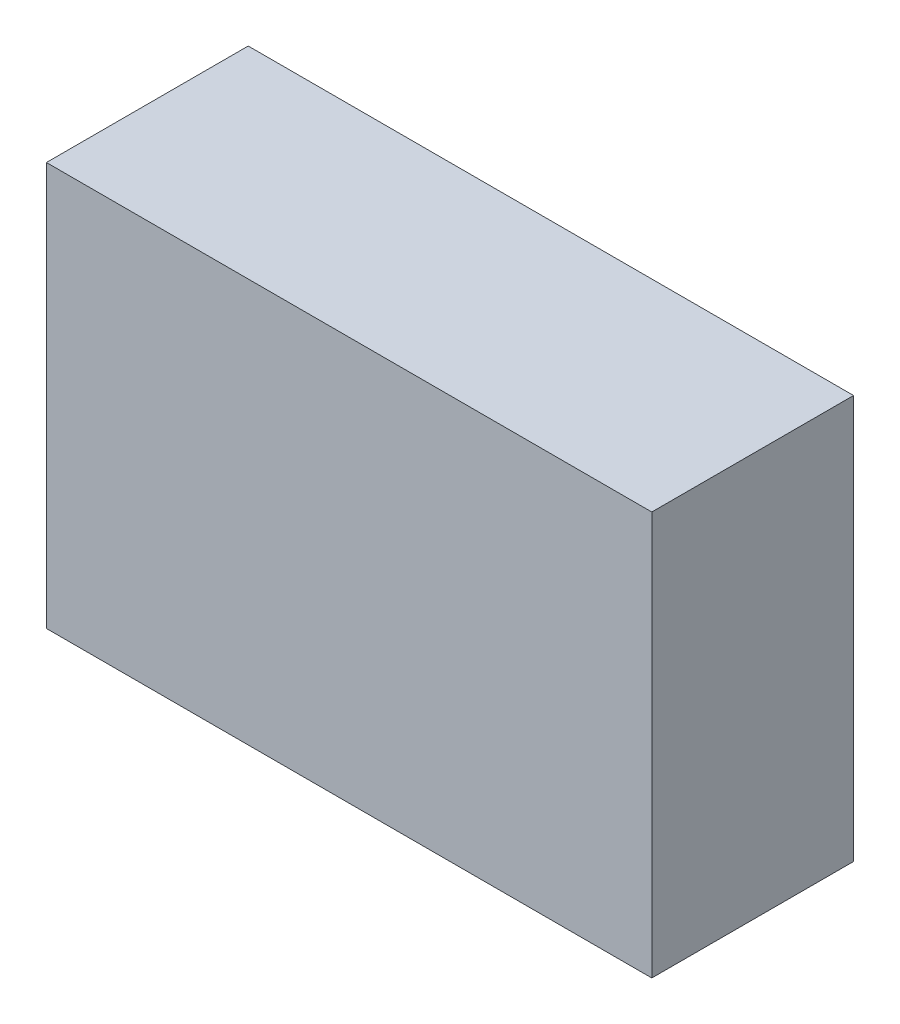
ISO-10303-21;
HEADER;
FILE_DESCRIPTION(('STEP AP214'),'2;1');
FILE_NAME('part.step','',(''),(''),'','','');
FILE_SCHEMA(('AUTOMOTIVE_DESIGN { 1 0 10303 214 1 1 1 1 }'));
ENDSEC;
DATA;
#1=APPLICATION_CONTEXT('core data for automotive mechanical design processes');
#2=APPLICATION_PROTOCOL_DEFINITION('international standard','automotive_design',2000,#1);
#3=PRODUCT_CONTEXT('',#1,'mechanical');
#4=PRODUCT('Part','Part','',(#3));
#5=PRODUCT_RELATED_PRODUCT_CATEGORY('part','',(#4));
#6=PRODUCT_DEFINITION_FORMATION('','',#4);
#7=PRODUCT_DEFINITION_CONTEXT('part definition',#1,'design');
#8=PRODUCT_DEFINITION('design','',#6,#7);
#9=PRODUCT_DEFINITION_SHAPE('','',#8);
#10=(LENGTH_UNIT() NAMED_UNIT(*) SI_UNIT(.MILLI.,.METRE.));
#11=(NAMED_UNIT(*) PLANE_ANGLE_UNIT() SI_UNIT($,.RADIAN.));
#12=(NAMED_UNIT(*) SI_UNIT($,.STERADIAN.) SOLID_ANGLE_UNIT());
#13=UNCERTAINTY_MEASURE_WITH_UNIT(LENGTH_MEASURE(1.E-05),#10,'distance_accuracy_value','');
#14=(GEOMETRIC_REPRESENTATION_CONTEXT(3) GLOBAL_UNCERTAINTY_ASSIGNED_CONTEXT((#13)) GLOBAL_UNIT_ASSIGNED_CONTEXT((#10,
#11,#12)) REPRESENTATION_CONTEXT('',''));
#15=CARTESIAN_POINT('',(0.,0.,0.));
#16=DIRECTION('',(0.,0.,1.));
#17=DIRECTION('',(1.,0.,0.));
#18=AXIS2_PLACEMENT_3D('',#15,#16,#17);
#19=CARTESIAN_POINT('',(1.35,-0.2,0.));
#20=DIRECTION('',(0.,0.,1.));
#21=DIRECTION('',(1.,0.,0.));
#22=AXIS2_PLACEMENT_3D('',#19,#20,#21);
#23=PLANE('',#22);
#24=DIRECTION('',(0.,1.,0.));
#25=VECTOR('',#24,1.);
#26=CARTESIAN_POINT('',(1.5,-0.3,0.));
#27=LINE('',#26,#25);
#28=CARTESIAN_POINT('',(1.5,-0.3,0.));
#29=VERTEX_POINT('',#28);
#30=CARTESIAN_POINT('',(1.5,-0.1,0.));
#31=VERTEX_POINT('',#30);
#32=EDGE_CURVE('E79',#29,#31,#27,.T.);
#33=ORIENTED_EDGE('',*,*,#32,.F.);
#34=DIRECTION('',(1.,0.,0.));
#35=VECTOR('',#34,1.);
#36=CARTESIAN_POINT('',(1.2,-0.3,0.));
#37=LINE('',#36,#35);
#38=CARTESIAN_POINT('',(1.2,-0.3,0.));
#39=VERTEX_POINT('',#38);
#40=EDGE_CURVE('E55',#39,#29,#37,.T.);
#41=ORIENTED_EDGE('',*,*,#40,.F.);
#42=DIRECTION('',(0.,1.,0.));
#43=VECTOR('',#42,1.);
#44=CARTESIAN_POINT('',(1.2,-0.1,0.));
#45=LINE('',#44,#43);
#46=CARTESIAN_POINT('',(1.2,-0.1,0.));
#47=VERTEX_POINT('',#46);
#48=EDGE_CURVE('E57',#47,#39,#45,.F.);
#49=ORIENTED_EDGE('',*,*,#48,.F.);
#50=DIRECTION('',(1.,0.,0.));
#51=VECTOR('',#50,1.);
#52=CARTESIAN_POINT('',(1.5,-0.1,0.));
#53=LINE('',#52,#51);
#54=EDGE_CURVE('E20',#31,#47,#53,.F.);
#55=ORIENTED_EDGE('',*,*,#54,.F.);
#56=EDGE_LOOP('',(#33,#41,#49,#55));
#57=FACE_BOUND('',#56,.T.);
#58=ADVANCED_FACE('F17',(#57),#23,.F.);
#59=CARTESIAN_POINT('',(1.5,-0.1,0.));
#60=DIRECTION('',(0.,1.,0.));
#61=DIRECTION('',(0.,0.,1.));
#62=AXIS2_PLACEMENT_3D('',#59,#60,#61);
#63=PLANE('',#62);
#64=DIRECTION('',(1.,0.,0.));
#65=VECTOR('',#64,1.);
#66=CARTESIAN_POINT('',(1.35,-0.1,0.1));
#67=LINE('',#66,#65);
#68=CARTESIAN_POINT('',(1.5,-0.1,0.1));
#69=VERTEX_POINT('',#68);
#70=CARTESIAN_POINT('',(1.2,-0.1,0.1));
#71=VERTEX_POINT('',#70);
#72=EDGE_CURVE('E83',#69,#71,#67,.F.);
#73=ORIENTED_EDGE('',*,*,#72,.F.);
#74=DIRECTION('',(0.,0.,-1.));
#75=VECTOR('',#74,1.);
#76=CARTESIAN_POINT('',(1.5,-0.1,0.));
#77=LINE('',#76,#75);
#78=EDGE_CURVE('E68',#31,#69,#77,.F.);
#79=ORIENTED_EDGE('',*,*,#78,.F.);
#80=ORIENTED_EDGE('',*,*,#54,.T.);
#81=DIRECTION('',(0.,0.,1.));
#82=VECTOR('',#81,1.);
#83=CARTESIAN_POINT('',(1.2,-0.1,0.));
#84=LINE('',#83,#82);
#85=EDGE_CURVE('E63',#71,#47,#84,.F.);
#86=ORIENTED_EDGE('',*,*,#85,.F.);
#87=EDGE_LOOP('',(#73,#79,#80,#86));
#88=FACE_BOUND('',#87,.T.);
#89=ADVANCED_FACE('F65',(#88),#63,.T.);
#90=CARTESIAN_POINT('',(1.2,-0.1,0.));
#91=DIRECTION('',(-1.,0.,0.));
#92=DIRECTION('',(0.,0.,1.));
#93=AXIS2_PLACEMENT_3D('',#90,#91,#92);
#94=PLANE('',#93);
#95=DIRECTION('',(0.,1.,0.));
#96=VECTOR('',#95,1.);
#97=CARTESIAN_POINT('',(1.2,-0.2,0.1));
#98=LINE('',#97,#96);
#99=CARTESIAN_POINT('',(1.2,-0.3,0.1));
#100=VERTEX_POINT('',#99);
#101=EDGE_CURVE('E72',#71,#100,#98,.F.);
#102=ORIENTED_EDGE('',*,*,#101,.F.);
#103=ORIENTED_EDGE('',*,*,#85,.T.);
#104=ORIENTED_EDGE('',*,*,#48,.T.);
#105=DIRECTION('',(0.,0.,-1.));
#106=VECTOR('',#105,1.);
#107=CARTESIAN_POINT('',(1.2,-0.3,0.));
#108=LINE('',#107,#106);
#109=EDGE_CURVE('E75',#100,#39,#108,.T.);
#110=ORIENTED_EDGE('',*,*,#109,.F.);
#111=EDGE_LOOP('',(#102,#103,#104,#110));
#112=FACE_BOUND('',#111,.T.);
#113=ADVANCED_FACE('F70',(#112),#94,.T.);
#114=CARTESIAN_POINT('',(1.2,-0.3,0.));
#115=DIRECTION('',(0.,-1.,0.));
#116=DIRECTION('',(0.,0.,-1.));
#117=AXIS2_PLACEMENT_3D('',#114,#115,#116);
#118=PLANE('',#117);
#119=DIRECTION('',(1.,0.,0.));
#120=VECTOR('',#119,1.);
#121=CARTESIAN_POINT('',(1.35,-0.3,0.1));
#122=LINE('',#121,#120);
#123=CARTESIAN_POINT('',(1.5,-0.3,0.1));
#124=VERTEX_POINT('',#123);
#125=EDGE_CURVE('E26',#100,#124,#122,.T.);
#126=ORIENTED_EDGE('',*,*,#125,.F.);
#127=ORIENTED_EDGE('',*,*,#109,.T.);
#128=ORIENTED_EDGE('',*,*,#40,.T.);
#129=DIRECTION('',(0.,0.,-1.));
#130=VECTOR('',#129,1.);
#131=CARTESIAN_POINT('',(1.5,-0.3,0.));
#132=LINE('',#131,#130);
#133=EDGE_CURVE('E35',#124,#29,#132,.T.);
#134=ORIENTED_EDGE('',*,*,#133,.F.);
#135=EDGE_LOOP('',(#126,#127,#128,#134));
#136=FACE_BOUND('',#135,.T.);
#137=ADVANCED_FACE('F89',(#136),#118,.T.);
#138=CARTESIAN_POINT('',(1.5,-0.3,0.));
#139=DIRECTION('',(1.,0.,0.));
#140=DIRECTION('',(0.,0.,-1.));
#141=AXIS2_PLACEMENT_3D('',#138,#139,#140);
#142=PLANE('',#141);
#143=DIRECTION('',(0.,1.,0.));
#144=VECTOR('',#143,1.);
#145=CARTESIAN_POINT('',(1.5,-0.2,0.1));
#146=LINE('',#145,#144);
#147=EDGE_CURVE('E11',#124,#69,#146,.T.);
#148=ORIENTED_EDGE('',*,*,#147,.F.);
#149=ORIENTED_EDGE('',*,*,#133,.T.);
#150=ORIENTED_EDGE('',*,*,#32,.T.);
#151=ORIENTED_EDGE('',*,*,#78,.T.);
#152=EDGE_LOOP('',(#148,#149,#150,#151));
#153=FACE_BOUND('',#152,.T.);
#154=ADVANCED_FACE('F91',(#153),#142,.T.);
#155=CARTESIAN_POINT('',(1.35,-0.2,0.1));
#156=DIRECTION('',(0.,0.,1.));
#157=DIRECTION('',(1.,0.,0.));
#158=AXIS2_PLACEMENT_3D('',#155,#156,#157);
#159=PLANE('',#158);
#160=ORIENTED_EDGE('',*,*,#125,.T.);
#161=ORIENTED_EDGE('',*,*,#147,.T.);
#162=ORIENTED_EDGE('',*,*,#72,.T.);
#163=ORIENTED_EDGE('',*,*,#101,.T.);
#164=EDGE_LOOP('',(#160,#161,#162,#163));
#165=FACE_BOUND('',#164,.T.);
#166=ADVANCED_FACE('F88',(#165),#159,.T.);
#167=CLOSED_SHELL('',(#58,#89,#113,#137,#154,#166));
#168=MANIFOLD_SOLID_BREP('B1',#167);
#169=ADVANCED_BREP_SHAPE_REPRESENTATION('',(#18,#168),#14);
#170=SHAPE_DEFINITION_REPRESENTATION(#9,#169);
ENDSEC;
END-ISO-10303-21;
